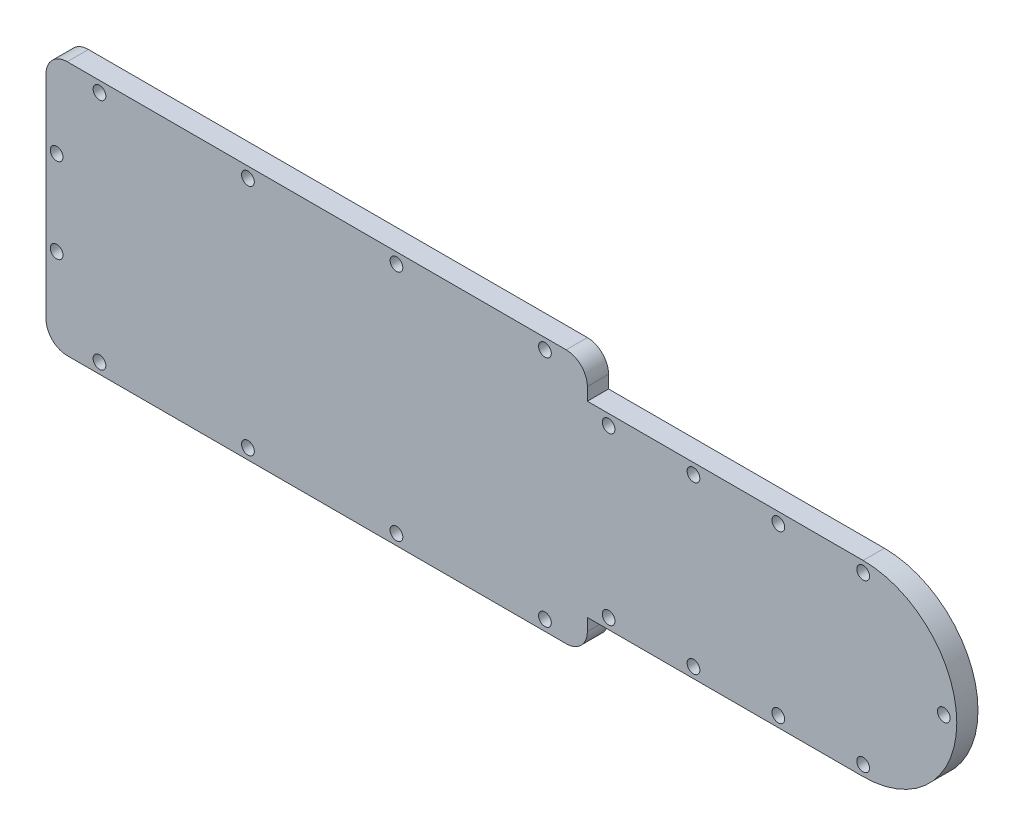
ISO-10303-21;
HEADER;
FILE_DESCRIPTION(('STEP AP214'),'2;1');
FILE_NAME('part.step','',(''),(''),'','','');
FILE_SCHEMA(('AUTOMOTIVE_DESIGN { 1 0 10303 214 1 1 1 1 }'));
ENDSEC;
DATA;
#1=APPLICATION_CONTEXT('core data for automotive mechanical design processes');
#2=APPLICATION_PROTOCOL_DEFINITION('international standard','automotive_design',2000,#1);
#3=PRODUCT_CONTEXT('',#1,'mechanical');
#4=PRODUCT('Part','Part','',(#3));
#5=PRODUCT_RELATED_PRODUCT_CATEGORY('part','',(#4));
#6=PRODUCT_DEFINITION_FORMATION('','',#4);
#7=PRODUCT_DEFINITION_CONTEXT('part definition',#1,'design');
#8=PRODUCT_DEFINITION('design','',#6,#7);
#9=PRODUCT_DEFINITION_SHAPE('','',#8);
#10=(LENGTH_UNIT() NAMED_UNIT(*) SI_UNIT(.MILLI.,.METRE.));
#11=(NAMED_UNIT(*) PLANE_ANGLE_UNIT() SI_UNIT($,.RADIAN.));
#12=(NAMED_UNIT(*) SI_UNIT($,.STERADIAN.) SOLID_ANGLE_UNIT());
#13=UNCERTAINTY_MEASURE_WITH_UNIT(LENGTH_MEASURE(1.E-05),#10,'distance_accuracy_value','');
#14=(GEOMETRIC_REPRESENTATION_CONTEXT(3) GLOBAL_UNCERTAINTY_ASSIGNED_CONTEXT((#13)) GLOBAL_UNIT_ASSIGNED_CONTEXT((#10,
#11,#12)) REPRESENTATION_CONTEXT('',''));
#15=CARTESIAN_POINT('',(0.,0.,0.));
#16=DIRECTION('',(0.,0.,1.));
#17=DIRECTION('',(1.,0.,0.));
#18=AXIS2_PLACEMENT_3D('',#15,#16,#17);
#19=CARTESIAN_POINT('',(-61.3,-10.,0.));
#20=DIRECTION('',(0.,0.,1.));
#21=DIRECTION('',(1.,0.,0.));
#22=AXIS2_PLACEMENT_3D('',#19,#20,#21);
#23=CYLINDRICAL_SURFACE('',#22,1.5);
#24=CARTESIAN_POINT('',(-61.3,-10.,0.));
#25=DIRECTION('',(0.,0.,1.));
#26=DIRECTION('',(1.,0.,0.));
#27=AXIS2_PLACEMENT_3D('',#24,#25,#26);
#28=CIRCLE('',#27,1.5);
#29=CARTESIAN_POINT('',(-59.8,-10.,0.));
#30=VERTEX_POINT('',#29);
#31=EDGE_CURVE('E55',#30,#30,#28,.T.);
#32=ORIENTED_EDGE('',*,*,#31,.F.);
#33=EDGE_LOOP('',(#32));
#34=FACE_BOUND('',#33,.T.);
#35=CARTESIAN_POINT('',(-61.3,-10.,5.));
#36=DIRECTION('',(0.,0.,1.));
#37=DIRECTION('',(1.,0.,0.));
#38=AXIS2_PLACEMENT_3D('',#35,#36,#37);
#39=CIRCLE('',#38,1.5);
#40=CARTESIAN_POINT('',(-59.8,-10.,5.));
#41=VERTEX_POINT('',#40);
#42=EDGE_CURVE('E11',#41,#41,#39,.T.);
#43=ORIENTED_EDGE('',*,*,#42,.T.);
#44=EDGE_LOOP('',(#43));
#45=FACE_BOUND('',#44,.T.);
#46=ADVANCED_FACE('F47',(#34,#45),#23,.F.);
#47=CARTESIAN_POINT('',(53.8,-27.5,0.));
#48=DIRECTION('',(0.,0.,1.));
#49=DIRECTION('',(1.,0.,0.));
#50=AXIS2_PLACEMENT_3D('',#47,#48,#49);
#51=CYLINDRICAL_SURFACE('',#50,1.5);
#52=CARTESIAN_POINT('',(53.8,-27.5,0.));
#53=DIRECTION('',(0.,0.,1.));
#54=DIRECTION('',(1.,0.,0.));
#55=AXIS2_PLACEMENT_3D('',#52,#53,#54);
#56=CIRCLE('',#55,1.5);
#57=CARTESIAN_POINT('',(55.3,-27.5,0.));
#58=VERTEX_POINT('',#57);
#59=EDGE_CURVE('E367',#58,#58,#56,.T.);
#60=ORIENTED_EDGE('',*,*,#59,.F.);
#61=EDGE_LOOP('',(#60));
#62=FACE_BOUND('',#61,.T.);
#63=CARTESIAN_POINT('',(53.8,-27.5,5.));
#64=DIRECTION('',(0.,0.,1.));
#65=DIRECTION('',(1.,0.,0.));
#66=AXIS2_PLACEMENT_3D('',#63,#64,#65);
#67=CIRCLE('',#66,1.5);
#68=CARTESIAN_POINT('',(55.3,-27.5,5.));
#69=VERTEX_POINT('',#68);
#70=EDGE_CURVE('E316',#69,#69,#67,.T.);
#71=ORIENTED_EDGE('',*,*,#70,.T.);
#72=EDGE_LOOP('',(#71));
#73=FACE_BOUND('',#72,.T.);
#74=ADVANCED_FACE('F299',(#62,#73),#51,.F.);
#75=CARTESIAN_POINT('',(18.8,-27.5,0.));
#76=DIRECTION('',(0.,0.,1.));
#77=DIRECTION('',(1.,0.,0.));
#78=AXIS2_PLACEMENT_3D('',#75,#76,#77);
#79=CYLINDRICAL_SURFACE('',#78,1.5);
#80=CARTESIAN_POINT('',(18.8,-27.5,0.));
#81=DIRECTION('',(0.,0.,1.));
#82=DIRECTION('',(1.,0.,0.));
#83=AXIS2_PLACEMENT_3D('',#80,#81,#82);
#84=CIRCLE('',#83,1.5);
#85=CARTESIAN_POINT('',(20.3,-27.5,0.));
#86=VERTEX_POINT('',#85);
#87=EDGE_CURVE('E363',#86,#86,#84,.T.);
#88=ORIENTED_EDGE('',*,*,#87,.F.);
#89=EDGE_LOOP('',(#88));
#90=FACE_BOUND('',#89,.T.);
#91=CARTESIAN_POINT('',(18.8,-27.5,5.));
#92=DIRECTION('',(0.,0.,1.));
#93=DIRECTION('',(1.,0.,0.));
#94=AXIS2_PLACEMENT_3D('',#91,#92,#93);
#95=CIRCLE('',#94,1.5);
#96=CARTESIAN_POINT('',(20.3,-27.5,5.));
#97=VERTEX_POINT('',#96);
#98=EDGE_CURVE('E320',#97,#97,#95,.T.);
#99=ORIENTED_EDGE('',*,*,#98,.T.);
#100=EDGE_LOOP('',(#99));
#101=FACE_BOUND('',#100,.T.);
#102=ADVANCED_FACE('F306',(#90,#101),#79,.F.);
#103=CARTESIAN_POINT('',(-16.2,-27.5,0.));
#104=DIRECTION('',(0.,0.,1.));
#105=DIRECTION('',(1.,0.,0.));
#106=AXIS2_PLACEMENT_3D('',#103,#104,#105);
#107=CYLINDRICAL_SURFACE('',#106,1.5);
#108=CARTESIAN_POINT('',(-16.2,-27.5,0.));
#109=DIRECTION('',(0.,0.,1.));
#110=DIRECTION('',(1.,0.,0.));
#111=AXIS2_PLACEMENT_3D('',#108,#109,#110);
#112=CIRCLE('',#111,1.5);
#113=CARTESIAN_POINT('',(-14.7,-27.5,0.));
#114=VERTEX_POINT('',#113);
#115=EDGE_CURVE('E359',#114,#114,#112,.T.);
#116=ORIENTED_EDGE('',*,*,#115,.F.);
#117=EDGE_LOOP('',(#116));
#118=FACE_BOUND('',#117,.T.);
#119=CARTESIAN_POINT('',(-16.2,-27.5,5.));
#120=DIRECTION('',(0.,0.,1.));
#121=DIRECTION('',(1.,0.,0.));
#122=AXIS2_PLACEMENT_3D('',#119,#120,#121);
#123=CIRCLE('',#122,1.5);
#124=CARTESIAN_POINT('',(-14.7,-27.5,5.));
#125=VERTEX_POINT('',#124);
#126=EDGE_CURVE('E324',#125,#125,#123,.T.);
#127=ORIENTED_EDGE('',*,*,#126,.T.);
#128=EDGE_LOOP('',(#127));
#129=FACE_BOUND('',#128,.T.);
#130=ADVANCED_FACE('F406',(#118,#129),#107,.F.);
#131=CARTESIAN_POINT('',(-51.2,-27.5,0.));
#132=DIRECTION('',(0.,0.,1.));
#133=DIRECTION('',(1.,0.,0.));
#134=AXIS2_PLACEMENT_3D('',#131,#132,#133);
#135=CYLINDRICAL_SURFACE('',#134,1.5);
#136=CARTESIAN_POINT('',(-51.2,-27.5,0.));
#137=DIRECTION('',(0.,0.,1.));
#138=DIRECTION('',(1.,0.,0.));
#139=AXIS2_PLACEMENT_3D('',#136,#137,#138);
#140=CIRCLE('',#139,1.5);
#141=CARTESIAN_POINT('',(-49.7,-27.5,0.));
#142=VERTEX_POINT('',#141);
#143=EDGE_CURVE('E355',#142,#142,#140,.T.);
#144=ORIENTED_EDGE('',*,*,#143,.F.);
#145=EDGE_LOOP('',(#144));
#146=FACE_BOUND('',#145,.T.);
#147=CARTESIAN_POINT('',(-51.2,-27.5,5.));
#148=DIRECTION('',(0.,0.,1.));
#149=DIRECTION('',(1.,0.,0.));
#150=AXIS2_PLACEMENT_3D('',#147,#148,#149);
#151=CIRCLE('',#150,1.5);
#152=CARTESIAN_POINT('',(-49.7,-27.5,5.));
#153=VERTEX_POINT('',#152);
#154=EDGE_CURVE('E328',#153,#153,#151,.T.);
#155=ORIENTED_EDGE('',*,*,#154,.T.);
#156=EDGE_LOOP('',(#155));
#157=FACE_BOUND('',#156,.T.);
#158=ADVANCED_FACE('F402',(#146,#157),#135,.F.);
#159=CARTESIAN_POINT('',(53.8,27.5,0.));
#160=DIRECTION('',(0.,0.,1.));
#161=DIRECTION('',(1.,0.,0.));
#162=AXIS2_PLACEMENT_3D('',#159,#160,#161);
#163=CYLINDRICAL_SURFACE('',#162,1.5);
#164=CARTESIAN_POINT('',(53.8,27.5,0.));
#165=DIRECTION('',(0.,0.,1.));
#166=DIRECTION('',(1.,0.,0.));
#167=AXIS2_PLACEMENT_3D('',#164,#165,#166);
#168=CIRCLE('',#167,1.5);
#169=CARTESIAN_POINT('',(55.3,27.5,0.));
#170=VERTEX_POINT('',#169);
#171=EDGE_CURVE('E351',#170,#170,#168,.T.);
#172=ORIENTED_EDGE('',*,*,#171,.F.);
#173=EDGE_LOOP('',(#172));
#174=FACE_BOUND('',#173,.T.);
#175=CARTESIAN_POINT('',(53.8,27.5,5.));
#176=DIRECTION('',(0.,0.,1.));
#177=DIRECTION('',(1.,0.,0.));
#178=AXIS2_PLACEMENT_3D('',#175,#176,#177);
#179=CIRCLE('',#178,1.5);
#180=CARTESIAN_POINT('',(55.3,27.5,5.));
#181=VERTEX_POINT('',#180);
#182=EDGE_CURVE('E332',#181,#181,#179,.T.);
#183=ORIENTED_EDGE('',*,*,#182,.T.);
#184=EDGE_LOOP('',(#183));
#185=FACE_BOUND('',#184,.T.);
#186=ADVANCED_FACE('F395',(#174,#185),#163,.F.);
#187=CARTESIAN_POINT('',(18.8,27.5,0.));
#188=DIRECTION('',(0.,0.,1.));
#189=DIRECTION('',(1.,0.,0.));
#190=AXIS2_PLACEMENT_3D('',#187,#188,#189);
#191=CYLINDRICAL_SURFACE('',#190,1.5);
#192=CARTESIAN_POINT('',(18.8,27.5,0.));
#193=DIRECTION('',(0.,0.,1.));
#194=DIRECTION('',(1.,0.,0.));
#195=AXIS2_PLACEMENT_3D('',#192,#193,#194);
#196=CIRCLE('',#195,1.5);
#197=CARTESIAN_POINT('',(20.3,27.5,0.));
#198=VERTEX_POINT('',#197);
#199=EDGE_CURVE('E341',#198,#198,#196,.T.);
#200=ORIENTED_EDGE('',*,*,#199,.F.);
#201=EDGE_LOOP('',(#200));
#202=FACE_BOUND('',#201,.T.);
#203=CARTESIAN_POINT('',(18.8,27.5,5.));
#204=DIRECTION('',(0.,0.,1.));
#205=DIRECTION('',(1.,0.,0.));
#206=AXIS2_PLACEMENT_3D('',#203,#204,#205);
#207=CIRCLE('',#206,1.5);
#208=CARTESIAN_POINT('',(20.3,27.5,5.));
#209=VERTEX_POINT('',#208);
#210=EDGE_CURVE('E336',#209,#209,#207,.T.);
#211=ORIENTED_EDGE('',*,*,#210,.T.);
#212=EDGE_LOOP('',(#211));
#213=FACE_BOUND('',#212,.T.);
#214=ADVANCED_FACE('F387',(#202,#213),#191,.F.);
#215=CARTESIAN_POINT('',(-16.2,27.5,0.));
#216=DIRECTION('',(0.,0.,1.));
#217=DIRECTION('',(1.,0.,0.));
#218=AXIS2_PLACEMENT_3D('',#215,#216,#217);
#219=CYLINDRICAL_SURFACE('',#218,1.5);
#220=CARTESIAN_POINT('',(-16.2,27.5,0.));
#221=DIRECTION('',(0.,0.,1.));
#222=DIRECTION('',(1.,0.,0.));
#223=AXIS2_PLACEMENT_3D('',#220,#221,#222);
#224=CIRCLE('',#223,1.5);
#225=CARTESIAN_POINT('',(-14.7,27.5,0.));
#226=VERTEX_POINT('',#225);
#227=EDGE_CURVE('E342',#226,#226,#224,.T.);
#228=ORIENTED_EDGE('',*,*,#227,.F.);
#229=EDGE_LOOP('',(#228));
#230=FACE_BOUND('',#229,.T.);
#231=CARTESIAN_POINT('',(-16.2,27.5,5.));
#232=DIRECTION('',(0.,0.,1.));
#233=DIRECTION('',(1.,0.,0.));
#234=AXIS2_PLACEMENT_3D('',#231,#232,#233);
#235=CIRCLE('',#234,1.5);
#236=CARTESIAN_POINT('',(-14.7,27.5,5.));
#237=VERTEX_POINT('',#236);
#238=EDGE_CURVE('E339',#237,#237,#235,.T.);
#239=ORIENTED_EDGE('',*,*,#238,.T.);
#240=EDGE_LOOP('',(#239));
#241=FACE_BOUND('',#240,.T.);
#242=ADVANCED_FACE('F385',(#230,#241),#219,.F.);
#243=CARTESIAN_POINT('',(128.81,-0.068001429999999,5.));
#244=DIRECTION('',(0.,0.,-1.));
#245=DIRECTION('',(-1.,0.,0.));
#246=AXIS2_PLACEMENT_3D('',#243,#244,#245);
#247=CYLINDRICAL_SURFACE('',#246,22.06800143);
#248=CARTESIAN_POINT('',(128.81,-0.068001429999999,0.));
#249=DIRECTION('',(0.,0.,1.));
#250=DIRECTION('',(1.,0.,0.));
#251=AXIS2_PLACEMENT_3D('',#248,#249,#250);
#252=CIRCLE('',#251,22.06800143);
#253=CARTESIAN_POINT('',(128.81,22.,0.));
#254=VERTEX_POINT('',#253);
#255=CARTESIAN_POINT('',(128.81,-22.13600286,0.));
#256=VERTEX_POINT('',#255);
#257=EDGE_CURVE('E185',#254,#256,#252,.F.);
#258=ORIENTED_EDGE('',*,*,#257,.F.);
#259=DIRECTION('',(0.,0.,-1.));
#260=VECTOR('',#259,1.);
#261=CARTESIAN_POINT('',(128.81,22.,5.));
#262=LINE('',#261,#260);
#263=CARTESIAN_POINT('',(128.81,22.,5.));
#264=VERTEX_POINT('',#263);
#265=EDGE_CURVE('E116',#264,#254,#262,.T.);
#266=ORIENTED_EDGE('',*,*,#265,.F.);
#267=CARTESIAN_POINT('',(128.81,-0.068001429999999,5.));
#268=DIRECTION('',(0.,0.,1.));
#269=DIRECTION('',(1.,0.,0.));
#270=AXIS2_PLACEMENT_3D('',#267,#268,#269);
#271=CIRCLE('',#270,22.06800143);
#272=CARTESIAN_POINT('',(128.81,-22.13600286,5.));
#273=VERTEX_POINT('',#272);
#274=EDGE_CURVE('E173',#264,#273,#271,.F.);
#275=ORIENTED_EDGE('',*,*,#274,.T.);
#276=DIRECTION('',(0.,0.,-1.));
#277=VECTOR('',#276,1.);
#278=CARTESIAN_POINT('',(128.81,-22.13600286,5.));
#279=LINE('',#278,#277);
#280=EDGE_CURVE('E111',#273,#256,#279,.T.);
#281=ORIENTED_EDGE('',*,*,#280,.T.);
#282=EDGE_LOOP('',(#258,#266,#275,#281));
#283=FACE_BOUND('',#282,.T.);
#284=ADVANCED_FACE('F386',(#283),#247,.T.);
#285=CARTESIAN_POINT('',(0.,22.,5.));
#286=DIRECTION('',(0.,1.,0.));
#287=DIRECTION('',(0.,0.,1.));
#288=AXIS2_PLACEMENT_3D('',#285,#286,#287);
#289=PLANE('',#288);
#290=DIRECTION('',(1.,0.,0.));
#291=VECTOR('',#290,1.);
#292=CARTESIAN_POINT('',(0.,22.,0.));
#293=LINE('',#292,#291);
#294=CARTESIAN_POINT('',(63.8,22.,0.));
#295=VERTEX_POINT('',#294);
#296=EDGE_CURVE('E616',#295,#254,#293,.T.);
#297=ORIENTED_EDGE('',*,*,#296,.F.);
#298=DIRECTION('',(0.,0.,-1.));
#299=VECTOR('',#298,1.);
#300=CARTESIAN_POINT('',(63.8,22.,5.));
#301=LINE('',#300,#299);
#302=CARTESIAN_POINT('',(63.8,22.,5.));
#303=VERTEX_POINT('',#302);
#304=EDGE_CURVE('E617',#303,#295,#301,.T.);
#305=ORIENTED_EDGE('',*,*,#304,.F.);
#306=DIRECTION('',(1.,0.,0.));
#307=VECTOR('',#306,1.);
#308=CARTESIAN_POINT('',(0.,22.,5.));
#309=LINE('',#308,#307);
#310=EDGE_CURVE('E167',#303,#264,#309,.T.);
#311=ORIENTED_EDGE('',*,*,#310,.T.);
#312=ORIENTED_EDGE('',*,*,#265,.T.);
#313=EDGE_LOOP('',(#297,#305,#311,#312));
#314=FACE_BOUND('',#313,.T.);
#315=ADVANCED_FACE('F393',(#314),#289,.T.);
#316=CARTESIAN_POINT('',(63.8,0.,5.));
#317=DIRECTION('',(-1.,0.,0.));
#318=DIRECTION('',(0.,0.,1.));
#319=AXIS2_PLACEMENT_3D('',#316,#317,#318);
#320=PLANE('',#319);
#321=DIRECTION('',(0.,1.,0.));
#322=VECTOR('',#321,1.);
#323=CARTESIAN_POINT('',(63.8,0.,0.));
#324=LINE('',#323,#322);
#325=CARTESIAN_POINT('',(63.8,25.,0.));
#326=VERTEX_POINT('',#325);
#327=EDGE_CURVE('E621',#295,#326,#324,.T.);
#328=ORIENTED_EDGE('',*,*,#327,.T.);
#329=DIRECTION('',(0.,0.,-1.));
#330=VECTOR('',#329,1.);
#331=CARTESIAN_POINT('',(63.8,25.,5.));
#332=LINE('',#331,#330);
#333=CARTESIAN_POINT('',(63.8,25.,5.));
#334=VERTEX_POINT('',#333);
#335=EDGE_CURVE('E658',#334,#326,#332,.T.);
#336=ORIENTED_EDGE('',*,*,#335,.F.);
#337=DIRECTION('',(0.,1.,0.));
#338=VECTOR('',#337,1.);
#339=CARTESIAN_POINT('',(63.8,0.,5.));
#340=LINE('',#339,#338);
#341=EDGE_CURVE('E162',#303,#334,#340,.T.);
#342=ORIENTED_EDGE('',*,*,#341,.F.);
#343=ORIENTED_EDGE('',*,*,#304,.T.);
#344=EDGE_LOOP('',(#328,#336,#342,#343));
#345=FACE_BOUND('',#344,.T.);
#346=ADVANCED_FACE('F544',(#345),#320,.F.);
#347=CARTESIAN_POINT('',(58.8,25.,5.));
#348=DIRECTION('',(0.,0.,-1.));
#349=DIRECTION('',(-1.,0.,0.));
#350=AXIS2_PLACEMENT_3D('',#347,#348,#349);
#351=CYLINDRICAL_SURFACE('',#350,5.);
#352=CARTESIAN_POINT('',(58.8,25.,0.));
#353=DIRECTION('',(0.,0.,1.));
#354=DIRECTION('',(1.,0.,0.));
#355=AXIS2_PLACEMENT_3D('',#352,#353,#354);
#356=CIRCLE('',#355,5.);
#357=CARTESIAN_POINT('',(58.8,30.,0.));
#358=VERTEX_POINT('',#357);
#359=EDGE_CURVE('E623',#326,#358,#356,.T.);
#360=ORIENTED_EDGE('',*,*,#359,.T.);
#361=DIRECTION('',(0.,0.,-1.));
#362=VECTOR('',#361,1.);
#363=CARTESIAN_POINT('',(58.8,30.,5.));
#364=LINE('',#363,#362);
#365=CARTESIAN_POINT('',(58.8,30.,5.));
#366=VERTEX_POINT('',#365);
#367=EDGE_CURVE('E656',#366,#358,#364,.T.);
#368=ORIENTED_EDGE('',*,*,#367,.F.);
#369=CARTESIAN_POINT('',(58.8,25.,5.));
#370=DIRECTION('',(0.,0.,1.));
#371=DIRECTION('',(1.,0.,0.));
#372=AXIS2_PLACEMENT_3D('',#369,#370,#371);
#373=CIRCLE('',#372,5.);
#374=EDGE_CURVE('E166',#334,#366,#373,.T.);
#375=ORIENTED_EDGE('',*,*,#374,.F.);
#376=ORIENTED_EDGE('',*,*,#335,.T.);
#377=EDGE_LOOP('',(#360,#368,#375,#376));
#378=FACE_BOUND('',#377,.T.);
#379=ADVANCED_FACE('F589',(#378),#351,.T.);
#380=CARTESIAN_POINT('',(0.,30.,5.));
#381=DIRECTION('',(0.,1.,0.));
#382=DIRECTION('',(0.,0.,1.));
#383=AXIS2_PLACEMENT_3D('',#380,#381,#382);
#384=PLANE('',#383);
#385=DIRECTION('',(1.,0.,0.));
#386=VECTOR('',#385,1.);
#387=CARTESIAN_POINT('',(0.,30.,0.));
#388=LINE('',#387,#386);
#389=CARTESIAN_POINT('',(-58.8,30.,0.));
#390=VERTEX_POINT('',#389);
#391=EDGE_CURVE('E629',#390,#358,#388,.T.);
#392=ORIENTED_EDGE('',*,*,#391,.F.);
#393=DIRECTION('',(0.,0.,-1.));
#394=VECTOR('',#393,1.);
#395=CARTESIAN_POINT('',(-58.8,30.,5.));
#396=LINE('',#395,#394);
#397=CARTESIAN_POINT('',(-58.8,30.,5.));
#398=VERTEX_POINT('',#397);
#399=EDGE_CURVE('E654',#398,#390,#396,.T.);
#400=ORIENTED_EDGE('',*,*,#399,.F.);
#401=DIRECTION('',(1.,0.,0.));
#402=VECTOR('',#401,1.);
#403=CARTESIAN_POINT('',(0.,30.,5.));
#404=LINE('',#403,#402);
#405=EDGE_CURVE('E171',#398,#366,#404,.T.);
#406=ORIENTED_EDGE('',*,*,#405,.T.);
#407=ORIENTED_EDGE('',*,*,#367,.T.);
#408=EDGE_LOOP('',(#392,#400,#406,#407));
#409=FACE_BOUND('',#408,.T.);
#410=ADVANCED_FACE('F581',(#409),#384,.T.);
#411=CARTESIAN_POINT('',(-58.8,25.,5.));
#412=DIRECTION('',(0.,0.,-1.));
#413=DIRECTION('',(-1.,0.,0.));
#414=AXIS2_PLACEMENT_3D('',#411,#412,#413);
#415=CYLINDRICAL_SURFACE('',#414,5.);
#416=CARTESIAN_POINT('',(-58.8,25.,0.));
#417=DIRECTION('',(0.,0.,1.));
#418=DIRECTION('',(1.,0.,0.));
#419=AXIS2_PLACEMENT_3D('',#416,#417,#418);
#420=CIRCLE('',#419,5.);
#421=CARTESIAN_POINT('',(-63.8,25.,0.));
#422=VERTEX_POINT('',#421);
#423=EDGE_CURVE('E632',#390,#422,#420,.T.);
#424=ORIENTED_EDGE('',*,*,#423,.T.);
#425=DIRECTION('',(0.,0.,-1.));
#426=VECTOR('',#425,1.);
#427=CARTESIAN_POINT('',(-63.8,25.,5.));
#428=LINE('',#427,#426);
#429=CARTESIAN_POINT('',(-63.8,25.,5.));
#430=VERTEX_POINT('',#429);
#431=EDGE_CURVE('E652',#430,#422,#428,.T.);
#432=ORIENTED_EDGE('',*,*,#431,.F.);
#433=CARTESIAN_POINT('',(-58.8,25.,5.));
#434=DIRECTION('',(0.,0.,1.));
#435=DIRECTION('',(1.,0.,0.));
#436=AXIS2_PLACEMENT_3D('',#433,#434,#435);
#437=CIRCLE('',#436,5.);
#438=EDGE_CURVE('E670',#398,#430,#437,.T.);
#439=ORIENTED_EDGE('',*,*,#438,.F.);
#440=ORIENTED_EDGE('',*,*,#399,.T.);
#441=EDGE_LOOP('',(#424,#432,#439,#440));
#442=FACE_BOUND('',#441,.T.);
#443=ADVANCED_FACE('F573',(#442),#415,.T.);
#444=CARTESIAN_POINT('',(-63.8,0.,5.));
#445=DIRECTION('',(-1.,0.,0.));
#446=DIRECTION('',(0.,0.,1.));
#447=AXIS2_PLACEMENT_3D('',#444,#445,#446);
#448=PLANE('',#447);
#449=DIRECTION('',(0.,1.,0.));
#450=VECTOR('',#449,1.);
#451=CARTESIAN_POINT('',(-63.8,0.,0.));
#452=LINE('',#451,#450);
#453=CARTESIAN_POINT('',(-63.8,-25.,0.));
#454=VERTEX_POINT('',#453);
#455=EDGE_CURVE('E635',#454,#422,#452,.T.);
#456=ORIENTED_EDGE('',*,*,#455,.F.);
#457=DIRECTION('',(0.,0.,-1.));
#458=VECTOR('',#457,1.);
#459=CARTESIAN_POINT('',(-63.8,-25.,5.));
#460=LINE('',#459,#458);
#461=CARTESIAN_POINT('',(-63.8,-25.,5.));
#462=VERTEX_POINT('',#461);
#463=EDGE_CURVE('E650',#462,#454,#460,.T.);
#464=ORIENTED_EDGE('',*,*,#463,.F.);
#465=DIRECTION('',(0.,1.,0.));
#466=VECTOR('',#465,1.);
#467=CARTESIAN_POINT('',(-63.8,0.,5.));
#468=LINE('',#467,#466);
#469=EDGE_CURVE('E673',#462,#430,#468,.T.);
#470=ORIENTED_EDGE('',*,*,#469,.T.);
#471=ORIENTED_EDGE('',*,*,#431,.T.);
#472=EDGE_LOOP('',(#456,#464,#470,#471));
#473=FACE_BOUND('',#472,.T.);
#474=ADVANCED_FACE('F565',(#473),#448,.T.);
#475=CARTESIAN_POINT('',(-58.8,-25.,5.));
#476=DIRECTION('',(0.,0.,-1.));
#477=DIRECTION('',(-1.,0.,0.));
#478=AXIS2_PLACEMENT_3D('',#475,#476,#477);
#479=CYLINDRICAL_SURFACE('',#478,5.);
#480=CARTESIAN_POINT('',(-58.8,-25.,0.));
#481=DIRECTION('',(0.,0.,1.));
#482=DIRECTION('',(1.,0.,0.));
#483=AXIS2_PLACEMENT_3D('',#480,#481,#482);
#484=CIRCLE('',#483,5.);
#485=CARTESIAN_POINT('',(-58.8,-30.,0.));
#486=VERTEX_POINT('',#485);
#487=EDGE_CURVE('E638',#454,#486,#484,.T.);
#488=ORIENTED_EDGE('',*,*,#487,.T.);
#489=DIRECTION('',(0.,0.,-1.));
#490=VECTOR('',#489,1.);
#491=CARTESIAN_POINT('',(-58.8,-30.,5.));
#492=LINE('',#491,#490);
#493=CARTESIAN_POINT('',(-58.8,-30.,5.));
#494=VERTEX_POINT('',#493);
#495=EDGE_CURVE('E647',#494,#486,#492,.T.);
#496=ORIENTED_EDGE('',*,*,#495,.F.);
#497=CARTESIAN_POINT('',(-58.8,-25.,5.));
#498=DIRECTION('',(0.,0.,1.));
#499=DIRECTION('',(1.,0.,0.));
#500=AXIS2_PLACEMENT_3D('',#497,#498,#499);
#501=CIRCLE('',#500,5.);
#502=EDGE_CURVE('E678',#462,#494,#501,.T.);
#503=ORIENTED_EDGE('',*,*,#502,.F.);
#504=ORIENTED_EDGE('',*,*,#463,.T.);
#505=EDGE_LOOP('',(#488,#496,#503,#504));
#506=FACE_BOUND('',#505,.T.);
#507=ADVANCED_FACE('F557',(#506),#479,.T.);
#508=CARTESIAN_POINT('',(0.,-30.,5.));
#509=DIRECTION('',(0.,1.,0.));
#510=DIRECTION('',(0.,0.,1.));
#511=AXIS2_PLACEMENT_3D('',#508,#509,#510);
#512=PLANE('',#511);
#513=DIRECTION('',(1.,0.,0.));
#514=VECTOR('',#513,1.);
#515=CARTESIAN_POINT('',(0.,-30.,0.));
#516=LINE('',#515,#514);
#517=CARTESIAN_POINT('',(58.8,-30.,0.));
#518=VERTEX_POINT('',#517);
#519=EDGE_CURVE('E640',#486,#518,#516,.T.);
#520=ORIENTED_EDGE('',*,*,#519,.T.);
#521=DIRECTION('',(0.,0.,-1.));
#522=VECTOR('',#521,1.);
#523=CARTESIAN_POINT('',(58.8,-30.,5.));
#524=LINE('',#523,#522);
#525=CARTESIAN_POINT('',(58.8,-30.,5.));
#526=VERTEX_POINT('',#525);
#527=EDGE_CURVE('E157',#526,#518,#524,.T.);
#528=ORIENTED_EDGE('',*,*,#527,.F.);
#529=DIRECTION('',(1.,0.,0.));
#530=VECTOR('',#529,1.);
#531=CARTESIAN_POINT('',(0.,-30.,5.));
#532=LINE('',#531,#530);
#533=EDGE_CURVE('E148',#494,#526,#532,.T.);
#534=ORIENTED_EDGE('',*,*,#533,.F.);
#535=ORIENTED_EDGE('',*,*,#495,.T.);
#536=EDGE_LOOP('',(#520,#528,#534,#535));
#537=FACE_BOUND('',#536,.T.);
#538=ADVANCED_FACE('F550',(#537),#512,.F.);
#539=CARTESIAN_POINT('',(58.8,-25.,5.));
#540=DIRECTION('',(0.,0.,-1.));
#541=DIRECTION('',(-1.,0.,0.));
#542=AXIS2_PLACEMENT_3D('',#539,#540,#541);
#543=CYLINDRICAL_SURFACE('',#542,5.);
#544=CARTESIAN_POINT('',(58.8,-25.,0.));
#545=DIRECTION('',(0.,0.,1.));
#546=DIRECTION('',(1.,0.,0.));
#547=AXIS2_PLACEMENT_3D('',#544,#545,#546);
#548=CIRCLE('',#547,5.);
#549=CARTESIAN_POINT('',(63.8,-25.,0.));
#550=VERTEX_POINT('',#549);
#551=EDGE_CURVE('E156',#518,#550,#548,.T.);
#552=ORIENTED_EDGE('',*,*,#551,.T.);
#553=DIRECTION('',(0.,0.,-1.));
#554=VECTOR('',#553,1.);
#555=CARTESIAN_POINT('',(63.8,-25.,5.));
#556=LINE('',#555,#554);
#557=CARTESIAN_POINT('',(63.8,-25.,5.));
#558=VERTEX_POINT('',#557);
#559=EDGE_CURVE('E153',#558,#550,#556,.T.);
#560=ORIENTED_EDGE('',*,*,#559,.F.);
#561=CARTESIAN_POINT('',(58.8,-25.,5.));
#562=DIRECTION('',(0.,0.,1.));
#563=DIRECTION('',(1.,0.,0.));
#564=AXIS2_PLACEMENT_3D('',#561,#562,#563);
#565=CIRCLE('',#564,5.);
#566=EDGE_CURVE('E142',#526,#558,#565,.T.);
#567=ORIENTED_EDGE('',*,*,#566,.F.);
#568=ORIENTED_EDGE('',*,*,#527,.T.);
#569=EDGE_LOOP('',(#552,#560,#567,#568));
#570=FACE_BOUND('',#569,.T.);
#571=ADVANCED_FACE('F154',(#570),#543,.T.);
#572=CARTESIAN_POINT('',(63.8,-22.13600286,0.));
#573=VERTEX_POINT('',#572);
#574=EDGE_CURVE('E104',#550,#573,#324,.T.);
#575=ORIENTED_EDGE('',*,*,#574,.T.);
#576=DIRECTION('',(0.,0.,-1.));
#577=VECTOR('',#576,1.);
#578=CARTESIAN_POINT('',(63.8,-22.13600286,5.));
#579=LINE('',#578,#577);
#580=CARTESIAN_POINT('',(63.8,-22.13600286,5.));
#581=VERTEX_POINT('',#580);
#582=EDGE_CURVE('E158',#581,#573,#579,.T.);
#583=ORIENTED_EDGE('',*,*,#582,.F.);
#584=EDGE_CURVE('E146',#558,#581,#340,.T.);
#585=ORIENTED_EDGE('',*,*,#584,.F.);
#586=ORIENTED_EDGE('',*,*,#559,.T.);
#587=EDGE_LOOP('',(#575,#583,#585,#586));
#588=FACE_BOUND('',#587,.T.);
#589=ADVANCED_FACE('F160',(#588),#320,.F.);
#590=CARTESIAN_POINT('',(0.,-22.13600286,5.));
#591=DIRECTION('',(0.,1.,0.));
#592=DIRECTION('',(0.,0.,1.));
#593=AXIS2_PLACEMENT_3D('',#590,#591,#592);
#594=PLANE('',#593);
#595=DIRECTION('',(1.,0.,0.));
#596=VECTOR('',#595,1.);
#597=CARTESIAN_POINT('',(0.,-22.13600286,0.));
#598=LINE('',#597,#596);
#599=EDGE_CURVE('E175',#573,#256,#598,.T.);
#600=ORIENTED_EDGE('',*,*,#599,.T.);
#601=ORIENTED_EDGE('',*,*,#280,.F.);
#602=DIRECTION('',(1.,0.,0.));
#603=VECTOR('',#602,1.);
#604=CARTESIAN_POINT('',(0.,-22.13600286,5.));
#605=LINE('',#604,#603);
#606=EDGE_CURVE('E63',#581,#273,#605,.T.);
#607=ORIENTED_EDGE('',*,*,#606,.F.);
#608=ORIENTED_EDGE('',*,*,#582,.T.);
#609=EDGE_LOOP('',(#600,#601,#607,#608));
#610=FACE_BOUND('',#609,.T.);
#611=ADVANCED_FACE('F258',(#610),#594,.F.);
#612=CARTESIAN_POINT('',(0.,0.,5.));
#613=DIRECTION('',(0.,0.,1.));
#614=DIRECTION('',(1.,0.,0.));
#615=AXIS2_PLACEMENT_3D('',#612,#613,#614);
#616=PLANE('',#615);
#617=ORIENTED_EDGE('',*,*,#42,.F.);
#618=EDGE_LOOP('',(#617));
#619=FACE_BOUND('',#618,.T.);
#620=ORIENTED_EDGE('',*,*,#70,.F.);
#621=EDGE_LOOP('',(#620));
#622=FACE_BOUND('',#621,.T.);
#623=ORIENTED_EDGE('',*,*,#98,.F.);
#624=EDGE_LOOP('',(#623));
#625=FACE_BOUND('',#624,.T.);
#626=ORIENTED_EDGE('',*,*,#126,.F.);
#627=EDGE_LOOP('',(#626));
#628=FACE_BOUND('',#627,.T.);
#629=ORIENTED_EDGE('',*,*,#154,.F.);
#630=EDGE_LOOP('',(#629));
#631=FACE_BOUND('',#630,.T.);
#632=ORIENTED_EDGE('',*,*,#182,.F.);
#633=EDGE_LOOP('',(#632));
#634=FACE_BOUND('',#633,.T.);
#635=ORIENTED_EDGE('',*,*,#210,.F.);
#636=EDGE_LOOP('',(#635));
#637=FACE_BOUND('',#636,.T.);
#638=ORIENTED_EDGE('',*,*,#238,.F.);
#639=EDGE_LOOP('',(#638));
#640=FACE_BOUND('',#639,.T.);
#641=CARTESIAN_POINT('',(-51.2,27.5,5.));
#642=DIRECTION('',(0.,0.,1.));
#643=DIRECTION('',(1.,0.,0.));
#644=AXIS2_PLACEMENT_3D('',#641,#642,#643);
#645=CIRCLE('',#644,1.5);
#646=CARTESIAN_POINT('',(-49.7,27.5,5.));
#647=VERTEX_POINT('',#646);
#648=EDGE_CURVE('E240',#647,#647,#645,.T.);
#649=ORIENTED_EDGE('',*,*,#648,.F.);
#650=EDGE_LOOP('',(#649));
#651=FACE_BOUND('',#650,.T.);
#652=CARTESIAN_POINT('',(-61.3,9.99999999999999,5.));
#653=DIRECTION('',(0.,0.,1.));
#654=DIRECTION('',(1.,0.,0.));
#655=AXIS2_PLACEMENT_3D('',#652,#653,#654);
#656=CIRCLE('',#655,1.5);
#657=CARTESIAN_POINT('',(-59.8,9.99999999999999,5.));
#658=VERTEX_POINT('',#657);
#659=EDGE_CURVE('E234',#658,#658,#656,.T.);
#660=ORIENTED_EDGE('',*,*,#659,.F.);
#661=EDGE_LOOP('',(#660));
#662=FACE_BOUND('',#661,.T.);
#663=CARTESIAN_POINT('',(88.8100000000003,-19.66,5.));
#664=DIRECTION('',(0.,0.,1.));
#665=DIRECTION('',(1.,0.,0.));
#666=AXIS2_PLACEMENT_3D('',#663,#664,#665);
#667=CIRCLE('',#666,1.5);
#668=CARTESIAN_POINT('',(90.3100000000003,-19.66,5.));
#669=VERTEX_POINT('',#668);
#670=EDGE_CURVE('E193',#669,#669,#667,.T.);
#671=ORIENTED_EDGE('',*,*,#670,.F.);
#672=EDGE_LOOP('',(#671));
#673=FACE_BOUND('',#672,.T.);
#674=CARTESIAN_POINT('',(108.81,-19.66,5.));
#675=DIRECTION('',(0.,0.,1.));
#676=DIRECTION('',(1.,0.,0.));
#677=AXIS2_PLACEMENT_3D('',#674,#675,#676);
#678=CIRCLE('',#677,1.5);
#679=CARTESIAN_POINT('',(110.31,-19.66,5.));
#680=VERTEX_POINT('',#679);
#681=EDGE_CURVE('E186',#680,#680,#678,.T.);
#682=ORIENTED_EDGE('',*,*,#681,.F.);
#683=EDGE_LOOP('',(#682));
#684=FACE_BOUND('',#683,.T.);
#685=CARTESIAN_POINT('',(128.81,-19.66,5.));
#686=DIRECTION('',(0.,0.,1.));
#687=DIRECTION('',(1.,0.,0.));
#688=AXIS2_PLACEMENT_3D('',#685,#686,#687);
#689=CIRCLE('',#688,1.5);
#690=CARTESIAN_POINT('',(130.31,-19.66,5.));
#691=VERTEX_POINT('',#690);
#692=EDGE_CURVE('E207',#691,#691,#689,.T.);
#693=ORIENTED_EDGE('',*,*,#692,.F.);
#694=EDGE_LOOP('',(#693));
#695=FACE_BOUND('',#694,.T.);
#696=CARTESIAN_POINT('',(68.8100000000003,-19.66,5.));
#697=DIRECTION('',(0.,0.,1.));
#698=DIRECTION('',(1.,0.,0.));
#699=AXIS2_PLACEMENT_3D('',#696,#697,#698);
#700=CIRCLE('',#699,1.5);
#701=CARTESIAN_POINT('',(70.3100000000003,-19.66,5.));
#702=VERTEX_POINT('',#701);
#703=EDGE_CURVE('E200',#702,#702,#700,.T.);
#704=ORIENTED_EDGE('',*,*,#703,.F.);
#705=EDGE_LOOP('',(#704));
#706=FACE_BOUND('',#705,.T.);
#707=CARTESIAN_POINT('',(147.81,0.,5.));
#708=DIRECTION('',(0.,0.,1.));
#709=DIRECTION('',(1.,0.,0.));
#710=AXIS2_PLACEMENT_3D('',#707,#708,#709);
#711=CIRCLE('',#710,1.5);
#712=CARTESIAN_POINT('',(149.31,0.,5.));
#713=VERTEX_POINT('',#712);
#714=EDGE_CURVE('E219',#713,#713,#711,.T.);
#715=ORIENTED_EDGE('',*,*,#714,.F.);
#716=EDGE_LOOP('',(#715));
#717=FACE_BOUND('',#716,.T.);
#718=CARTESIAN_POINT('',(88.8099999999999,19.5,5.));
#719=DIRECTION('',(0.,0.,1.));
#720=DIRECTION('',(1.,0.,0.));
#721=AXIS2_PLACEMENT_3D('',#718,#719,#720);
#722=CIRCLE('',#721,1.5);
#723=CARTESIAN_POINT('',(90.3099999999999,19.5,5.));
#724=VERTEX_POINT('',#723);
#725=EDGE_CURVE('E212',#724,#724,#722,.T.);
#726=ORIENTED_EDGE('',*,*,#725,.F.);
#727=EDGE_LOOP('',(#726));
#728=FACE_BOUND('',#727,.T.);
#729=CARTESIAN_POINT('',(108.81,19.5,5.));
#730=DIRECTION('',(0.,0.,1.));
#731=DIRECTION('',(1.,0.,0.));
#732=AXIS2_PLACEMENT_3D('',#729,#730,#731);
#733=CIRCLE('',#732,1.5);
#734=CARTESIAN_POINT('',(110.31,19.5,5.));
#735=VERTEX_POINT('',#734);
#736=EDGE_CURVE('E229',#735,#735,#733,.T.);
#737=ORIENTED_EDGE('',*,*,#736,.F.);
#738=EDGE_LOOP('',(#737));
#739=FACE_BOUND('',#738,.T.);
#740=CARTESIAN_POINT('',(128.81,19.5,5.));
#741=DIRECTION('',(0.,0.,1.));
#742=DIRECTION('',(1.,0.,0.));
#743=AXIS2_PLACEMENT_3D('',#740,#741,#742);
#744=CIRCLE('',#743,1.5);
#745=CARTESIAN_POINT('',(130.31,19.5,5.));
#746=VERTEX_POINT('',#745);
#747=EDGE_CURVE('E199',#746,#746,#744,.T.);
#748=ORIENTED_EDGE('',*,*,#747,.F.);
#749=EDGE_LOOP('',(#748));
#750=FACE_BOUND('',#749,.T.);
#751=CARTESIAN_POINT('',(68.8099999999999,19.5,5.));
#752=DIRECTION('',(0.,0.,1.));
#753=DIRECTION('',(1.,0.,0.));
#754=AXIS2_PLACEMENT_3D('',#751,#752,#753);
#755=CIRCLE('',#754,1.5);
#756=CARTESIAN_POINT('',(70.3099999999999,19.5,5.));
#757=VERTEX_POINT('',#756);
#758=EDGE_CURVE('E178',#757,#757,#755,.T.);
#759=ORIENTED_EDGE('',*,*,#758,.F.);
#760=EDGE_LOOP('',(#759));
#761=FACE_BOUND('',#760,.T.);
#762=ORIENTED_EDGE('',*,*,#274,.F.);
#763=ORIENTED_EDGE('',*,*,#310,.F.);
#764=ORIENTED_EDGE('',*,*,#341,.T.);
#765=ORIENTED_EDGE('',*,*,#374,.T.);
#766=ORIENTED_EDGE('',*,*,#405,.F.);
#767=ORIENTED_EDGE('',*,*,#438,.T.);
#768=ORIENTED_EDGE('',*,*,#469,.F.);
#769=ORIENTED_EDGE('',*,*,#502,.T.);
#770=ORIENTED_EDGE('',*,*,#533,.T.);
#771=ORIENTED_EDGE('',*,*,#566,.T.);
#772=ORIENTED_EDGE('',*,*,#584,.T.);
#773=ORIENTED_EDGE('',*,*,#606,.T.);
#774=EDGE_LOOP('',(#762,#763,#764,#765,#766,#767,#768,#769,#770,#771,#772,#773));
#775=FACE_BOUND('',#774,.T.);
#776=ADVANCED_FACE('F144',(#619,#622,#625,#628,#631,#634,#637,#640,#651,#662,#673,#684,#695,
#706,#717,#728,#739,#750,#761,#775),#616,.T.);
#777=CARTESIAN_POINT('',(0.,0.,0.));
#778=DIRECTION('',(0.,0.,1.));
#779=DIRECTION('',(1.,0.,0.));
#780=AXIS2_PLACEMENT_3D('',#777,#778,#779);
#781=PLANE('',#780);
#782=ORIENTED_EDGE('',*,*,#31,.T.);
#783=EDGE_LOOP('',(#782));
#784=FACE_BOUND('',#783,.T.);
#785=ORIENTED_EDGE('',*,*,#59,.T.);
#786=EDGE_LOOP('',(#785));
#787=FACE_BOUND('',#786,.T.);
#788=ORIENTED_EDGE('',*,*,#87,.T.);
#789=EDGE_LOOP('',(#788));
#790=FACE_BOUND('',#789,.T.);
#791=ORIENTED_EDGE('',*,*,#115,.T.);
#792=EDGE_LOOP('',(#791));
#793=FACE_BOUND('',#792,.T.);
#794=ORIENTED_EDGE('',*,*,#143,.T.);
#795=EDGE_LOOP('',(#794));
#796=FACE_BOUND('',#795,.T.);
#797=ORIENTED_EDGE('',*,*,#171,.T.);
#798=EDGE_LOOP('',(#797));
#799=FACE_BOUND('',#798,.T.);
#800=ORIENTED_EDGE('',*,*,#199,.T.);
#801=EDGE_LOOP('',(#800));
#802=FACE_BOUND('',#801,.T.);
#803=ORIENTED_EDGE('',*,*,#227,.T.);
#804=EDGE_LOOP('',(#803));
#805=FACE_BOUND('',#804,.T.);
#806=CARTESIAN_POINT('',(-51.2,27.5,0.));
#807=DIRECTION('',(0.,0.,1.));
#808=DIRECTION('',(1.,0.,0.));
#809=AXIS2_PLACEMENT_3D('',#806,#807,#808);
#810=CIRCLE('',#809,1.5);
#811=CARTESIAN_POINT('',(-49.7,27.5,0.));
#812=VERTEX_POINT('',#811);
#813=EDGE_CURVE('E204',#812,#812,#810,.T.);
#814=ORIENTED_EDGE('',*,*,#813,.T.);
#815=EDGE_LOOP('',(#814));
#816=FACE_BOUND('',#815,.T.);
#817=CARTESIAN_POINT('',(-61.3,9.99999999999999,0.));
#818=DIRECTION('',(0.,0.,1.));
#819=DIRECTION('',(1.,0.,0.));
#820=AXIS2_PLACEMENT_3D('',#817,#818,#819);
#821=CIRCLE('',#820,1.5);
#822=CARTESIAN_POINT('',(-59.8,9.99999999999999,0.));
#823=VERTEX_POINT('',#822);
#824=EDGE_CURVE('E237',#823,#823,#821,.T.);
#825=ORIENTED_EDGE('',*,*,#824,.T.);
#826=EDGE_LOOP('',(#825));
#827=FACE_BOUND('',#826,.T.);
#828=CARTESIAN_POINT('',(88.8100000000003,-19.66,0.));
#829=DIRECTION('',(0.,0.,1.));
#830=DIRECTION('',(1.,0.,0.));
#831=AXIS2_PLACEMENT_3D('',#828,#829,#830);
#832=CIRCLE('',#831,1.5);
#833=CARTESIAN_POINT('',(90.3100000000003,-19.66,0.));
#834=VERTEX_POINT('',#833);
#835=EDGE_CURVE('E196',#834,#834,#832,.T.);
#836=ORIENTED_EDGE('',*,*,#835,.T.);
#837=EDGE_LOOP('',(#836));
#838=FACE_BOUND('',#837,.T.);
#839=CARTESIAN_POINT('',(108.81,-19.66,0.));
#840=DIRECTION('',(0.,0.,1.));
#841=DIRECTION('',(1.,0.,0.));
#842=AXIS2_PLACEMENT_3D('',#839,#840,#841);
#843=CIRCLE('',#842,1.5);
#844=CARTESIAN_POINT('',(110.31,-19.66,0.));
#845=VERTEX_POINT('',#844);
#846=EDGE_CURVE('E189',#845,#845,#843,.T.);
#847=ORIENTED_EDGE('',*,*,#846,.T.);
#848=EDGE_LOOP('',(#847));
#849=FACE_BOUND('',#848,.T.);
#850=CARTESIAN_POINT('',(128.81,-19.66,0.));
#851=DIRECTION('',(0.,0.,1.));
#852=DIRECTION('',(1.,0.,0.));
#853=AXIS2_PLACEMENT_3D('',#850,#851,#852);
#854=CIRCLE('',#853,1.5);
#855=CARTESIAN_POINT('',(130.31,-19.66,0.));
#856=VERTEX_POINT('',#855);
#857=EDGE_CURVE('E190',#856,#856,#854,.T.);
#858=ORIENTED_EDGE('',*,*,#857,.T.);
#859=EDGE_LOOP('',(#858));
#860=FACE_BOUND('',#859,.T.);
#861=CARTESIAN_POINT('',(68.8100000000003,-19.66,0.));
#862=DIRECTION('',(0.,0.,1.));
#863=DIRECTION('',(1.,0.,0.));
#864=AXIS2_PLACEMENT_3D('',#861,#862,#863);
#865=CIRCLE('',#864,1.5);
#866=CARTESIAN_POINT('',(70.3100000000003,-19.66,0.));
#867=VERTEX_POINT('',#866);
#868=EDGE_CURVE('E203',#867,#867,#865,.T.);
#869=ORIENTED_EDGE('',*,*,#868,.T.);
#870=EDGE_LOOP('',(#869));
#871=FACE_BOUND('',#870,.T.);
#872=CARTESIAN_POINT('',(147.81,0.,0.));
#873=DIRECTION('',(0.,0.,1.));
#874=DIRECTION('',(1.,0.,0.));
#875=AXIS2_PLACEMENT_3D('',#872,#873,#874);
#876=CIRCLE('',#875,1.5);
#877=CARTESIAN_POINT('',(149.31,0.,0.));
#878=VERTEX_POINT('',#877);
#879=EDGE_CURVE('E182',#878,#878,#876,.T.);
#880=ORIENTED_EDGE('',*,*,#879,.T.);
#881=EDGE_LOOP('',(#880));
#882=FACE_BOUND('',#881,.T.);
#883=CARTESIAN_POINT('',(88.8099999999999,19.5,0.));
#884=DIRECTION('',(0.,0.,1.));
#885=DIRECTION('',(1.,0.,0.));
#886=AXIS2_PLACEMENT_3D('',#883,#884,#885);
#887=CIRCLE('',#886,1.5);
#888=CARTESIAN_POINT('',(90.3099999999999,19.5,0.));
#889=VERTEX_POINT('',#888);
#890=EDGE_CURVE('E215',#889,#889,#887,.T.);
#891=ORIENTED_EDGE('',*,*,#890,.T.);
#892=EDGE_LOOP('',(#891));
#893=FACE_BOUND('',#892,.T.);
#894=CARTESIAN_POINT('',(108.81,19.5,0.));
#895=DIRECTION('',(0.,0.,1.));
#896=DIRECTION('',(1.,0.,0.));
#897=AXIS2_PLACEMENT_3D('',#894,#895,#896);
#898=CIRCLE('',#897,1.5);
#899=CARTESIAN_POINT('',(110.31,19.5,0.));
#900=VERTEX_POINT('',#899);
#901=EDGE_CURVE('E216',#900,#900,#898,.T.);
#902=ORIENTED_EDGE('',*,*,#901,.T.);
#903=EDGE_LOOP('',(#902));
#904=FACE_BOUND('',#903,.T.);
#905=CARTESIAN_POINT('',(128.81,19.5,0.));
#906=DIRECTION('',(0.,0.,1.));
#907=DIRECTION('',(1.,0.,0.));
#908=AXIS2_PLACEMENT_3D('',#905,#906,#907);
#909=CIRCLE('',#908,1.5);
#910=CARTESIAN_POINT('',(130.31,19.5,0.));
#911=VERTEX_POINT('',#910);
#912=EDGE_CURVE('E226',#911,#911,#909,.T.);
#913=ORIENTED_EDGE('',*,*,#912,.T.);
#914=EDGE_LOOP('',(#913));
#915=FACE_BOUND('',#914,.T.);
#916=CARTESIAN_POINT('',(68.8099999999999,19.5,0.));
#917=DIRECTION('',(0.,0.,1.));
#918=DIRECTION('',(1.,0.,0.));
#919=AXIS2_PLACEMENT_3D('',#916,#917,#918);
#920=CIRCLE('',#919,1.5);
#921=CARTESIAN_POINT('',(70.3099999999999,19.5,0.));
#922=VERTEX_POINT('',#921);
#923=EDGE_CURVE('E181',#922,#922,#920,.T.);
#924=ORIENTED_EDGE('',*,*,#923,.T.);
#925=EDGE_LOOP('',(#924));
#926=FACE_BOUND('',#925,.T.);
#927=ORIENTED_EDGE('',*,*,#257,.T.);
#928=ORIENTED_EDGE('',*,*,#599,.F.);
#929=ORIENTED_EDGE('',*,*,#574,.F.);
#930=ORIENTED_EDGE('',*,*,#551,.F.);
#931=ORIENTED_EDGE('',*,*,#519,.F.);
#932=ORIENTED_EDGE('',*,*,#487,.F.);
#933=ORIENTED_EDGE('',*,*,#455,.T.);
#934=ORIENTED_EDGE('',*,*,#423,.F.);
#935=ORIENTED_EDGE('',*,*,#391,.T.);
#936=ORIENTED_EDGE('',*,*,#359,.F.);
#937=ORIENTED_EDGE('',*,*,#327,.F.);
#938=ORIENTED_EDGE('',*,*,#296,.T.);
#939=EDGE_LOOP('',(#927,#928,#929,#930,#931,#932,#933,#934,#935,#936,#937,#938));
#940=FACE_BOUND('',#939,.T.);
#941=ADVANCED_FACE('F246',(#784,#787,#790,#793,#796,#799,#802,#805,#816,#827,#838,#849,#860,
#871,#882,#893,#904,#915,#926,#940),#781,.F.);
#942=CARTESIAN_POINT('',(68.8099999999999,19.5,0.));
#943=DIRECTION('',(0.,0.,1.));
#944=DIRECTION('',(1.,0.,0.));
#945=AXIS2_PLACEMENT_3D('',#942,#943,#944);
#946=CYLINDRICAL_SURFACE('',#945,1.5);
#947=ORIENTED_EDGE('',*,*,#923,.F.);
#948=EDGE_LOOP('',(#947));
#949=FACE_BOUND('',#948,.T.);
#950=ORIENTED_EDGE('',*,*,#758,.T.);
#951=EDGE_LOOP('',(#950));
#952=FACE_BOUND('',#951,.T.);
#953=ADVANCED_FACE('F281',(#949,#952),#946,.F.);
#954=CARTESIAN_POINT('',(128.81,19.5,0.));
#955=DIRECTION('',(0.,0.,1.));
#956=DIRECTION('',(1.,0.,0.));
#957=AXIS2_PLACEMENT_3D('',#954,#955,#956);
#958=CYLINDRICAL_SURFACE('',#957,1.5);
#959=ORIENTED_EDGE('',*,*,#912,.F.);
#960=EDGE_LOOP('',(#959));
#961=FACE_BOUND('',#960,.T.);
#962=ORIENTED_EDGE('',*,*,#747,.T.);
#963=EDGE_LOOP('',(#962));
#964=FACE_BOUND('',#963,.T.);
#965=ADVANCED_FACE('F283',(#961,#964),#958,.F.);
#966=CARTESIAN_POINT('',(108.81,19.5,0.));
#967=DIRECTION('',(0.,0.,1.));
#968=DIRECTION('',(1.,0.,0.));
#969=AXIS2_PLACEMENT_3D('',#966,#967,#968);
#970=CYLINDRICAL_SURFACE('',#969,1.5);
#971=ORIENTED_EDGE('',*,*,#901,.F.);
#972=EDGE_LOOP('',(#971));
#973=FACE_BOUND('',#972,.T.);
#974=ORIENTED_EDGE('',*,*,#736,.T.);
#975=EDGE_LOOP('',(#974));
#976=FACE_BOUND('',#975,.T.);
#977=ADVANCED_FACE('F290',(#973,#976),#970,.F.);
#978=CARTESIAN_POINT('',(88.8099999999999,19.5,0.));
#979=DIRECTION('',(0.,0.,1.));
#980=DIRECTION('',(1.,0.,0.));
#981=AXIS2_PLACEMENT_3D('',#978,#979,#980);
#982=CYLINDRICAL_SURFACE('',#981,1.5);
#983=ORIENTED_EDGE('',*,*,#890,.F.);
#984=EDGE_LOOP('',(#983));
#985=FACE_BOUND('',#984,.T.);
#986=ORIENTED_EDGE('',*,*,#725,.T.);
#987=EDGE_LOOP('',(#986));
#988=FACE_BOUND('',#987,.T.);
#989=ADVANCED_FACE('F489',(#985,#988),#982,.F.);
#990=CARTESIAN_POINT('',(147.81,0.,0.));
#991=DIRECTION('',(0.,0.,1.));
#992=DIRECTION('',(1.,0.,0.));
#993=AXIS2_PLACEMENT_3D('',#990,#991,#992);
#994=CYLINDRICAL_SURFACE('',#993,1.5);
#995=ORIENTED_EDGE('',*,*,#879,.F.);
#996=EDGE_LOOP('',(#995));
#997=FACE_BOUND('',#996,.T.);
#998=ORIENTED_EDGE('',*,*,#714,.T.);
#999=EDGE_LOOP('',(#998));
#1000=FACE_BOUND('',#999,.T.);
#1001=ADVANCED_FACE('F481',(#997,#1000),#994,.F.);
#1002=CARTESIAN_POINT('',(68.8100000000003,-19.66,0.));
#1003=DIRECTION('',(0.,0.,1.));
#1004=DIRECTION('',(1.,0.,0.));
#1005=AXIS2_PLACEMENT_3D('',#1002,#1003,#1004);
#1006=CYLINDRICAL_SURFACE('',#1005,1.5);
#1007=ORIENTED_EDGE('',*,*,#868,.F.);
#1008=EDGE_LOOP('',(#1007));
#1009=FACE_BOUND('',#1008,.T.);
#1010=ORIENTED_EDGE('',*,*,#703,.T.);
#1011=EDGE_LOOP('',(#1010));
#1012=FACE_BOUND('',#1011,.T.);
#1013=ADVANCED_FACE('F473',(#1009,#1012),#1006,.F.);
#1014=CARTESIAN_POINT('',(128.81,-19.66,0.));
#1015=DIRECTION('',(0.,0.,1.));
#1016=DIRECTION('',(1.,0.,0.));
#1017=AXIS2_PLACEMENT_3D('',#1014,#1015,#1016);
#1018=CYLINDRICAL_SURFACE('',#1017,1.5);
#1019=ORIENTED_EDGE('',*,*,#857,.F.);
#1020=EDGE_LOOP('',(#1019));
#1021=FACE_BOUND('',#1020,.T.);
#1022=ORIENTED_EDGE('',*,*,#692,.T.);
#1023=EDGE_LOOP('',(#1022));
#1024=FACE_BOUND('',#1023,.T.);
#1025=ADVANCED_FACE('F466',(#1021,#1024),#1018,.F.);
#1026=CARTESIAN_POINT('',(108.81,-19.66,0.));
#1027=DIRECTION('',(0.,0.,1.));
#1028=DIRECTION('',(1.,0.,0.));
#1029=AXIS2_PLACEMENT_3D('',#1026,#1027,#1028);
#1030=CYLINDRICAL_SURFACE('',#1029,1.5);
#1031=ORIENTED_EDGE('',*,*,#846,.F.);
#1032=EDGE_LOOP('',(#1031));
#1033=FACE_BOUND('',#1032,.T.);
#1034=ORIENTED_EDGE('',*,*,#681,.T.);
#1035=EDGE_LOOP('',(#1034));
#1036=FACE_BOUND('',#1035,.T.);
#1037=ADVANCED_FACE('F458',(#1033,#1036),#1030,.F.);
#1038=CARTESIAN_POINT('',(88.8100000000003,-19.66,0.));
#1039=DIRECTION('',(0.,0.,1.));
#1040=DIRECTION('',(1.,0.,0.));
#1041=AXIS2_PLACEMENT_3D('',#1038,#1039,#1040);
#1042=CYLINDRICAL_SURFACE('',#1041,1.5);
#1043=ORIENTED_EDGE('',*,*,#835,.F.);
#1044=EDGE_LOOP('',(#1043));
#1045=FACE_BOUND('',#1044,.T.);
#1046=ORIENTED_EDGE('',*,*,#670,.T.);
#1047=EDGE_LOOP('',(#1046));
#1048=FACE_BOUND('',#1047,.T.);
#1049=ADVANCED_FACE('F450',(#1045,#1048),#1042,.F.);
#1050=CARTESIAN_POINT('',(-61.3,9.99999999999999,0.));
#1051=DIRECTION('',(0.,0.,1.));
#1052=DIRECTION('',(1.,0.,0.));
#1053=AXIS2_PLACEMENT_3D('',#1050,#1051,#1052);
#1054=CYLINDRICAL_SURFACE('',#1053,1.5);
#1055=ORIENTED_EDGE('',*,*,#824,.F.);
#1056=EDGE_LOOP('',(#1055));
#1057=FACE_BOUND('',#1056,.T.);
#1058=ORIENTED_EDGE('',*,*,#659,.T.);
#1059=EDGE_LOOP('',(#1058));
#1060=FACE_BOUND('',#1059,.T.);
#1061=ADVANCED_FACE('F252',(#1057,#1060),#1054,.F.);
#1062=CARTESIAN_POINT('',(-51.2,27.5,0.));
#1063=DIRECTION('',(0.,0.,1.));
#1064=DIRECTION('',(1.,0.,0.));
#1065=AXIS2_PLACEMENT_3D('',#1062,#1063,#1064);
#1066=CYLINDRICAL_SURFACE('',#1065,1.5);
#1067=ORIENTED_EDGE('',*,*,#813,.F.);
#1068=EDGE_LOOP('',(#1067));
#1069=FACE_BOUND('',#1068,.T.);
#1070=ORIENTED_EDGE('',*,*,#648,.T.);
#1071=EDGE_LOOP('',(#1070));
#1072=FACE_BOUND('',#1071,.T.);
#1073=ADVANCED_FACE('F249',(#1069,#1072),#1066,.F.);
#1074=CLOSED_SHELL('',(#46,#74,#102,#130,#158,#186,#214,#242,#284,#315,#346,#379,#410,#443,#474,
#507,#538,#571,#589,#611,#776,#941,#953,#965,#977,#989,#1001,#1013,#1025,#1037,#1049,#1061,#1073));
#1075=MANIFOLD_SOLID_BREP('B2',#1074);
#1076=ADVANCED_BREP_SHAPE_REPRESENTATION('',(#18,#1075),#14);
#1077=SHAPE_DEFINITION_REPRESENTATION(#9,#1076);
ENDSEC;
END-ISO-10303-21;
